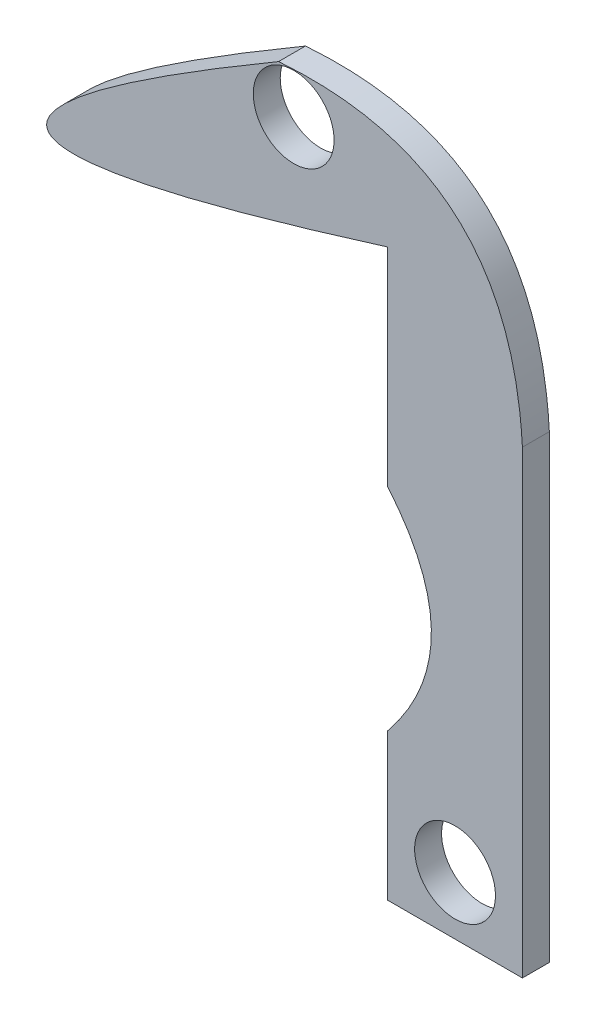
ISO-10303-21;
HEADER;
FILE_DESCRIPTION(('STEP AP214'),'2;1');
FILE_NAME('part.step','',(''),(''),'','','');
FILE_SCHEMA(('AUTOMOTIVE_DESIGN { 1 0 10303 214 1 1 1 1 }'));
ENDSEC;
DATA;
#1=APPLICATION_CONTEXT('core data for automotive mechanical design processes');
#2=APPLICATION_PROTOCOL_DEFINITION('international standard','automotive_design',2000,#1);
#3=PRODUCT_CONTEXT('',#1,'mechanical');
#4=PRODUCT('Part','Part','',(#3));
#5=PRODUCT_RELATED_PRODUCT_CATEGORY('part','',(#4));
#6=PRODUCT_DEFINITION_FORMATION('','',#4);
#7=PRODUCT_DEFINITION_CONTEXT('part definition',#1,'design');
#8=PRODUCT_DEFINITION('design','',#6,#7);
#9=PRODUCT_DEFINITION_SHAPE('','',#8);
#10=(LENGTH_UNIT() NAMED_UNIT(*) SI_UNIT(.MILLI.,.METRE.));
#11=(NAMED_UNIT(*) PLANE_ANGLE_UNIT() SI_UNIT($,.RADIAN.));
#12=(NAMED_UNIT(*) SI_UNIT($,.STERADIAN.) SOLID_ANGLE_UNIT());
#13=UNCERTAINTY_MEASURE_WITH_UNIT(LENGTH_MEASURE(1.E-05),#10,'distance_accuracy_value','');
#14=(GEOMETRIC_REPRESENTATION_CONTEXT(3) GLOBAL_UNCERTAINTY_ASSIGNED_CONTEXT((#13)) GLOBAL_UNIT_ASSIGNED_CONTEXT((#10,
#11,#12)) REPRESENTATION_CONTEXT('',''));
#15=CARTESIAN_POINT('',(0.,0.,0.));
#16=DIRECTION('',(0.,0.,1.));
#17=DIRECTION('',(1.,0.,0.));
#18=AXIS2_PLACEMENT_3D('',#15,#16,#17);
#19=CARTESIAN_POINT('',(0.,42.,2.));
#20=DIRECTION('',(1.,0.,0.));
#21=DIRECTION('',(0.,1.,0.));
#22=AXIS2_PLACEMENT_3D('',#19,#20,#21);
#23=PLANE('',#22);
#24=DIRECTION('',(0.,-1.,0.));
#25=VECTOR('',#24,1.);
#26=CARTESIAN_POINT('',(0.,42.,2.));
#27=LINE('',#26,#25);
#28=CARTESIAN_POINT('',(0.,10.8956049284162,2.));
#29=VERTEX_POINT('',#28);
#30=CARTESIAN_POINT('',(0.,0.,2.));
#31=VERTEX_POINT('',#30);
#32=EDGE_CURVE('E146',#29,#31,#27,.T.);
#33=ORIENTED_EDGE('',*,*,#32,.F.);
#34=DIRECTION('',(0.,0.,1.));
#35=VECTOR('',#34,1.);
#36=CARTESIAN_POINT('',(0.,10.8956049284162,-8.));
#37=LINE('',#36,#35);
#38=CARTESIAN_POINT('',(0.,10.8956049284162,0.));
#39=VERTEX_POINT('',#38);
#40=EDGE_CURVE('E168',#39,#29,#37,.T.);
#41=ORIENTED_EDGE('',*,*,#40,.F.);
#42=DIRECTION('',(0.,-1.,0.));
#43=VECTOR('',#42,1.);
#44=CARTESIAN_POINT('',(0.,42.,0.));
#45=LINE('',#44,#43);
#46=CARTESIAN_POINT('',(0.,0.,0.));
#47=VERTEX_POINT('',#46);
#48=EDGE_CURVE('E176',#39,#47,#45,.T.);
#49=ORIENTED_EDGE('',*,*,#48,.T.);
#50=DIRECTION('',(0.,0.,-1.));
#51=VECTOR('',#50,1.);
#52=CARTESIAN_POINT('',(0.,0.,2.));
#53=LINE('',#52,#51);
#54=EDGE_CURVE('E161',#31,#47,#53,.T.);
#55=ORIENTED_EDGE('',*,*,#54,.F.);
#56=EDGE_LOOP('',(#33,#41,#49,#55));
#57=FACE_BOUND('',#56,.T.);
#58=ADVANCED_FACE('F33',(#57),#23,.F.);
#59=CARTESIAN_POINT('',(0.,42.,0.));
#60=VERTEX_POINT('',#59);
#61=CARTESIAN_POINT('',(0.,26.5869440036249,0.));
#62=VERTEX_POINT('',#61);
#63=EDGE_CURVE('E125',#60,#62,#45,.T.);
#64=ORIENTED_EDGE('',*,*,#63,.T.);
#65=DIRECTION('',(0.,0.,1.));
#66=VECTOR('',#65,1.);
#67=CARTESIAN_POINT('',(0.,26.5869440036249,-8.));
#68=LINE('',#67,#66);
#69=CARTESIAN_POINT('',(0.,26.5869440036249,2.));
#70=VERTEX_POINT('',#69);
#71=EDGE_CURVE('E59',#62,#70,#68,.T.);
#72=ORIENTED_EDGE('',*,*,#71,.T.);
#73=CARTESIAN_POINT('',(0.,42.,2.));
#74=VERTEX_POINT('',#73);
#75=EDGE_CURVE('E117',#74,#70,#27,.T.);
#76=ORIENTED_EDGE('',*,*,#75,.F.);
#77=DIRECTION('',(0.,0.,-1.));
#78=VECTOR('',#77,1.);
#79=CARTESIAN_POINT('',(0.,42.,2.));
#80=LINE('',#79,#78);
#81=EDGE_CURVE('E115',#74,#60,#80,.T.);
#82=ORIENTED_EDGE('',*,*,#81,.T.);
#83=EDGE_LOOP('',(#64,#72,#76,#82));
#84=FACE_BOUND('',#83,.T.);
#85=ADVANCED_FACE('F35',(#84),#23,.F.);
#86=CARTESIAN_POINT('',(0.,0.,2.));
#87=DIRECTION('',(0.,1.,0.));
#88=DIRECTION('',(0.,0.,1.));
#89=AXIS2_PLACEMENT_3D('',#86,#87,#88);
#90=PLANE('',#89);
#91=DIRECTION('',(1.,0.,0.));
#92=VECTOR('',#91,1.);
#93=CARTESIAN_POINT('',(0.,0.,0.));
#94=LINE('',#93,#92);
#95=CARTESIAN_POINT('',(10.,0.,0.));
#96=VERTEX_POINT('',#95);
#97=EDGE_CURVE('E182',#47,#96,#94,.T.);
#98=ORIENTED_EDGE('',*,*,#97,.T.);
#99=DIRECTION('',(0.,0.,-1.));
#100=VECTOR('',#99,1.);
#101=CARTESIAN_POINT('',(10.,0.,2.));
#102=LINE('',#101,#100);
#103=CARTESIAN_POINT('',(10.,0.,2.));
#104=VERTEX_POINT('',#103);
#105=EDGE_CURVE('E160',#104,#96,#102,.T.);
#106=ORIENTED_EDGE('',*,*,#105,.F.);
#107=DIRECTION('',(1.,0.,0.));
#108=VECTOR('',#107,1.);
#109=CARTESIAN_POINT('',(0.,0.,2.));
#110=LINE('',#109,#108);
#111=EDGE_CURVE('E111',#31,#104,#110,.T.);
#112=ORIENTED_EDGE('',*,*,#111,.F.);
#113=ORIENTED_EDGE('',*,*,#54,.T.);
#114=EDGE_LOOP('',(#98,#106,#112,#113));
#115=FACE_BOUND('',#114,.T.);
#116=ADVANCED_FACE('F193',(#115),#90,.F.);
#117=CARTESIAN_POINT('',(10.,18.,2.));
#118=DIRECTION('',(-1.,0.,0.));
#119=DIRECTION('',(0.,-1.,0.));
#120=AXIS2_PLACEMENT_3D('',#117,#118,#119);
#121=PLANE('',#120);
#122=DIRECTION('',(0.,1.,0.));
#123=VECTOR('',#122,1.);
#124=CARTESIAN_POINT('',(10.,18.,0.));
#125=LINE('',#124,#123);
#126=CARTESIAN_POINT('',(10.,34.129750272309,0.));
#127=VERTEX_POINT('',#126);
#128=EDGE_CURVE('E107',#96,#127,#125,.T.);
#129=ORIENTED_EDGE('',*,*,#128,.T.);
#130=DIRECTION('',(0.,0.,1.));
#131=VECTOR('',#130,1.);
#132=CARTESIAN_POINT('',(10.,34.129750272309,-8.));
#133=LINE('',#132,#131);
#134=CARTESIAN_POINT('',(10.,34.129750272309,2.));
#135=VERTEX_POINT('',#134);
#136=EDGE_CURVE('E51',#127,#135,#133,.T.);
#137=ORIENTED_EDGE('',*,*,#136,.T.);
#138=DIRECTION('',(0.,1.,0.));
#139=VECTOR('',#138,1.);
#140=CARTESIAN_POINT('',(10.,0.,2.));
#141=LINE('',#140,#139);
#142=EDGE_CURVE('E106',#104,#135,#141,.T.);
#143=ORIENTED_EDGE('',*,*,#142,.F.);
#144=ORIENTED_EDGE('',*,*,#105,.T.);
#145=EDGE_LOOP('',(#129,#137,#143,#144));
#146=FACE_BOUND('',#145,.T.);
#147=ADVANCED_FACE('F104',(#146),#121,.F.);
#148=CARTESIAN_POINT('',(10.,60.,2.));
#149=CARTESIAN_POINT('',(-55.2264804778381,24.7255681051652,2.));
#150=CARTESIAN_POINT('',(0.,42.,2.));
#151=B_SPLINE_CURVE_WITH_KNOTS('',2,(#148,#149,#150),.UNSPECIFIED.,.F.,.F.,(3,3),(0.,1.),.UNSPECIFIED.);
#152=DIRECTION('',(0.,0.,-1.));
#153=VECTOR('',#152,1.);
#154=SURFACE_OF_LINEAR_EXTRUSION('',#151,#153);
#155=CARTESIAN_POINT('',(-8.1049537278397,49.8724284198984,2.));
#156=VERTEX_POINT('',#155);
#157=EDGE_CURVE('E113',#156,#74,#151,.T.);
#158=ORIENTED_EDGE('',*,*,#157,.F.);
#159=DIRECTION('',(0.,0.,1.));
#160=VECTOR('',#159,1.);
#161=CARTESIAN_POINT('',(-8.1049537278397,49.8724284198984,-8.));
#162=LINE('',#161,#160);
#163=CARTESIAN_POINT('',(-8.1049537278397,49.8724284198984,0.));
#164=VERTEX_POINT('',#163);
#165=EDGE_CURVE('E96',#164,#156,#162,.T.);
#166=ORIENTED_EDGE('',*,*,#165,.F.);
#167=CARTESIAN_POINT('',(10.,60.,0.));
#168=CARTESIAN_POINT('',(-55.2264804778381,24.7255681051652,0.));
#169=CARTESIAN_POINT('',(0.,42.,0.));
#170=B_SPLINE_CURVE_WITH_KNOTS('',2,(#167,#168,#169),.UNSPECIFIED.,.F.,.F.,(3,3),(0.,1.),.UNSPECIFIED.);
#171=EDGE_CURVE('E143',#164,#60,#170,.T.);
#172=ORIENTED_EDGE('',*,*,#171,.T.);
#173=ORIENTED_EDGE('',*,*,#81,.F.);
#174=EDGE_LOOP('',(#158,#166,#172,#173));
#175=FACE_BOUND('',#174,.T.);
#176=ADVANCED_FACE('F132',(#175),#154,.F.);
#177=CARTESIAN_POINT('',(-25.1132402389191,37.8627840525826,2.));
#178=DIRECTION('',(0.,0.,-1.));
#179=DIRECTION('',(-1.,0.,0.));
#180=AXIS2_PLACEMENT_3D('',#177,#178,#179);
#181=PLANE('',#180);
#182=CARTESIAN_POINT('',(-6.97959808409643,46.8724284198984,2.));
#183=DIRECTION('',(0.,0.,-1.));
#184=DIRECTION('',(-1.,0.,0.));
#185=AXIS2_PLACEMENT_3D('',#182,#183,#184);
#186=CIRCLE('',#185,3.);
#187=CARTESIAN_POINT('',(-9.97959808409643,46.8724284198984,2.));
#188=VERTEX_POINT('',#187);
#189=EDGE_CURVE('E100',#188,#188,#186,.T.);
#190=ORIENTED_EDGE('',*,*,#189,.T.);
#191=EDGE_LOOP('',(#190));
#192=FACE_BOUND('',#191,.T.);
#193=CARTESIAN_POINT('',(5.,4.28850487353273,2.));
#194=DIRECTION('',(0.,0.,1.));
#195=DIRECTION('',(1.,0.,0.));
#196=AXIS2_PLACEMENT_3D('',#193,#194,#195);
#197=CIRCLE('',#196,3.);
#198=CARTESIAN_POINT('',(8.,4.28850487353273,2.));
#199=VERTEX_POINT('',#198);
#200=EDGE_CURVE('E178',#199,#199,#197,.T.);
#201=ORIENTED_EDGE('',*,*,#200,.F.);
#202=EDGE_LOOP('',(#201));
#203=FACE_BOUND('',#202,.T.);
#204=ORIENTED_EDGE('',*,*,#142,.T.);
#205=CARTESIAN_POINT('',(-8.10495368036336,49.8724284477358,2.));
#206=CARTESIAN_POINT('',(9.07036569116707,51.1756463234316,2.));
#207=CARTESIAN_POINT('',(10.,34.129750272309,2.));
#208=B_SPLINE_CURVE_WITH_KNOTS('',2,(#205,#206,#207),.UNSPECIFIED.,.F.,.F.,(3,3),(0.,1.),.UNSPECIFIED.);
#209=EDGE_CURVE('E93',#156,#135,#208,.T.);
#210=ORIENTED_EDGE('',*,*,#209,.F.);
#211=ORIENTED_EDGE('',*,*,#157,.T.);
#212=ORIENTED_EDGE('',*,*,#75,.T.);
#213=CARTESIAN_POINT('',(0.,10.8956049284162,2.));
#214=CARTESIAN_POINT('',(6.48093075260273,18.9004068979429,2.));
#215=CARTESIAN_POINT('',(0.,26.5869440036249,2.));
#216=B_SPLINE_CURVE_WITH_KNOTS('',2,(#213,#214,#215),.UNSPECIFIED.,.F.,.F.,(3,3),(0.,1.),.UNSPECIFIED.);
#217=EDGE_CURVE('E192',#29,#70,#216,.T.);
#218=ORIENTED_EDGE('',*,*,#217,.F.);
#219=ORIENTED_EDGE('',*,*,#32,.T.);
#220=ORIENTED_EDGE('',*,*,#111,.T.);
#221=EDGE_LOOP('',(#204,#210,#211,#212,#218,#219,#220));
#222=FACE_BOUND('',#221,.T.);
#223=ADVANCED_FACE('F109',(#192,#203,#222),#181,.F.);
#224=CARTESIAN_POINT('',(-25.1132402389191,37.8627840525826,0.));
#225=DIRECTION('',(0.,0.,-1.));
#226=DIRECTION('',(-1.,0.,0.));
#227=AXIS2_PLACEMENT_3D('',#224,#225,#226);
#228=PLANE('',#227);
#229=CARTESIAN_POINT('',(-6.97959808409643,46.8724284198984,0.));
#230=DIRECTION('',(0.,0.,-1.));
#231=DIRECTION('',(-1.,0.,0.));
#232=AXIS2_PLACEMENT_3D('',#229,#230,#231);
#233=CIRCLE('',#232,3.);
#234=CARTESIAN_POINT('',(-9.97959808409643,46.8724284198984,0.));
#235=VERTEX_POINT('',#234);
#236=EDGE_CURVE('E305',#235,#235,#233,.T.);
#237=ORIENTED_EDGE('',*,*,#236,.F.);
#238=EDGE_LOOP('',(#237));
#239=FACE_BOUND('',#238,.T.);
#240=CARTESIAN_POINT('',(-8.10495368036336,49.8724284477358,0.));
#241=CARTESIAN_POINT('',(9.07036569116707,51.1756463234316,0.));
#242=CARTESIAN_POINT('',(10.,34.129750272309,0.));
#243=B_SPLINE_CURVE_WITH_KNOTS('',2,(#240,#241,#242),.UNSPECIFIED.,.F.,.F.,(3,3),(0.,1.),.UNSPECIFIED.);
#244=EDGE_CURVE('E11',#127,#164,#243,.F.);
#245=ORIENTED_EDGE('',*,*,#244,.F.);
#246=ORIENTED_EDGE('',*,*,#128,.F.);
#247=ORIENTED_EDGE('',*,*,#97,.F.);
#248=ORIENTED_EDGE('',*,*,#48,.F.);
#249=CARTESIAN_POINT('',(0.,10.8956049284162,0.));
#250=CARTESIAN_POINT('',(6.48093075260273,18.9004068979429,0.));
#251=CARTESIAN_POINT('',(0.,26.5869440036249,0.));
#252=B_SPLINE_CURVE_WITH_KNOTS('',2,(#249,#250,#251),.UNSPECIFIED.,.F.,.F.,(3,3),(0.,1.),.UNSPECIFIED.);
#253=EDGE_CURVE('E44',#62,#39,#252,.F.);
#254=ORIENTED_EDGE('',*,*,#253,.F.);
#255=ORIENTED_EDGE('',*,*,#63,.F.);
#256=ORIENTED_EDGE('',*,*,#171,.F.);
#257=EDGE_LOOP('',(#245,#246,#247,#248,#254,#255,#256));
#258=FACE_BOUND('',#257,.T.);
#259=CARTESIAN_POINT('',(5.,4.28850487353273,0.));
#260=DIRECTION('',(0.,0.,1.));
#261=DIRECTION('',(1.,0.,0.));
#262=AXIS2_PLACEMENT_3D('',#259,#260,#261);
#263=CIRCLE('',#262,3.);
#264=CARTESIAN_POINT('',(8.,4.28850487353273,0.));
#265=VERTEX_POINT('',#264);
#266=EDGE_CURVE('E183',#265,#265,#263,.T.);
#267=ORIENTED_EDGE('',*,*,#266,.T.);
#268=EDGE_LOOP('',(#267));
#269=FACE_BOUND('',#268,.T.);
#270=ADVANCED_FACE('F180',(#239,#258,#269),#228,.T.);
#271=CARTESIAN_POINT('',(5.,4.28850487353273,0.));
#272=DIRECTION('',(0.,0.,1.));
#273=DIRECTION('',(1.,0.,0.));
#274=AXIS2_PLACEMENT_3D('',#271,#272,#273);
#275=CYLINDRICAL_SURFACE('',#274,3.);
#276=ORIENTED_EDGE('',*,*,#266,.F.);
#277=EDGE_LOOP('',(#276));
#278=FACE_BOUND('',#277,.T.);
#279=ORIENTED_EDGE('',*,*,#200,.T.);
#280=EDGE_LOOP('',(#279));
#281=FACE_BOUND('',#280,.T.);
#282=ADVANCED_FACE('F218',(#278,#281),#275,.F.);
#283=CARTESIAN_POINT('',(0.,10.8956049284162,-8.));
#284=CARTESIAN_POINT('',(6.48093075260273,18.9004068979429,-8.));
#285=CARTESIAN_POINT('',(0.,26.5869440036249,-8.));
#286=B_SPLINE_CURVE_WITH_KNOTS('',2,(#283,#284,#285),.UNSPECIFIED.,.F.,.F.,(3,3),(0.,1.),.UNSPECIFIED.);
#287=DIRECTION('',(0.,0.,1.));
#288=VECTOR('',#287,1.);
#289=SURFACE_OF_LINEAR_EXTRUSION('',#286,#288);
#290=ORIENTED_EDGE('',*,*,#253,.T.);
#291=ORIENTED_EDGE('',*,*,#40,.T.);
#292=ORIENTED_EDGE('',*,*,#217,.T.);
#293=ORIENTED_EDGE('',*,*,#71,.F.);
#294=EDGE_LOOP('',(#290,#291,#292,#293));
#295=FACE_BOUND('',#294,.T.);
#296=ADVANCED_FACE('F167',(#295),#289,.F.);
#297=CARTESIAN_POINT('',(-8.10495368036336,49.8724284477358,-8.));
#298=CARTESIAN_POINT('',(9.07036569116707,51.1756463234316,-8.));
#299=CARTESIAN_POINT('',(10.,34.129750272309,-8.));
#300=B_SPLINE_CURVE_WITH_KNOTS('',2,(#297,#298,#299),.UNSPECIFIED.,.F.,.F.,(3,3),(0.,1.),.UNSPECIFIED.);
#301=DIRECTION('',(0.,0.,1.));
#302=VECTOR('',#301,1.);
#303=SURFACE_OF_LINEAR_EXTRUSION('',#300,#302);
#304=ORIENTED_EDGE('',*,*,#244,.T.);
#305=ORIENTED_EDGE('',*,*,#165,.T.);
#306=ORIENTED_EDGE('',*,*,#209,.T.);
#307=ORIENTED_EDGE('',*,*,#136,.F.);
#308=EDGE_LOOP('',(#304,#305,#306,#307));
#309=FACE_BOUND('',#308,.T.);
#310=ADVANCED_FACE('F94',(#309),#303,.F.);
#311=CARTESIAN_POINT('',(-6.97959808409643,46.8724284198984,10.));
#312=DIRECTION('',(0.,0.,-1.));
#313=DIRECTION('',(-1.,0.,0.));
#314=AXIS2_PLACEMENT_3D('',#311,#312,#313);
#315=CYLINDRICAL_SURFACE('',#314,3.);
#316=ORIENTED_EDGE('',*,*,#236,.T.);
#317=EDGE_LOOP('',(#316));
#318=FACE_BOUND('',#317,.T.);
#319=ORIENTED_EDGE('',*,*,#189,.F.);
#320=EDGE_LOOP('',(#319));
#321=FACE_BOUND('',#320,.T.);
#322=ADVANCED_FACE('F245',(#318,#321),#315,.F.);
#323=CLOSED_SHELL('',(#58,#85,#116,#147,#176,#223,#270,#282,#296,#310,#322));
#324=MANIFOLD_SOLID_BREP('B2',#323);
#325=ADVANCED_BREP_SHAPE_REPRESENTATION('',(#18,#324),#14);
#326=SHAPE_DEFINITION_REPRESENTATION(#9,#325);
ENDSEC;
END-ISO-10303-21;
